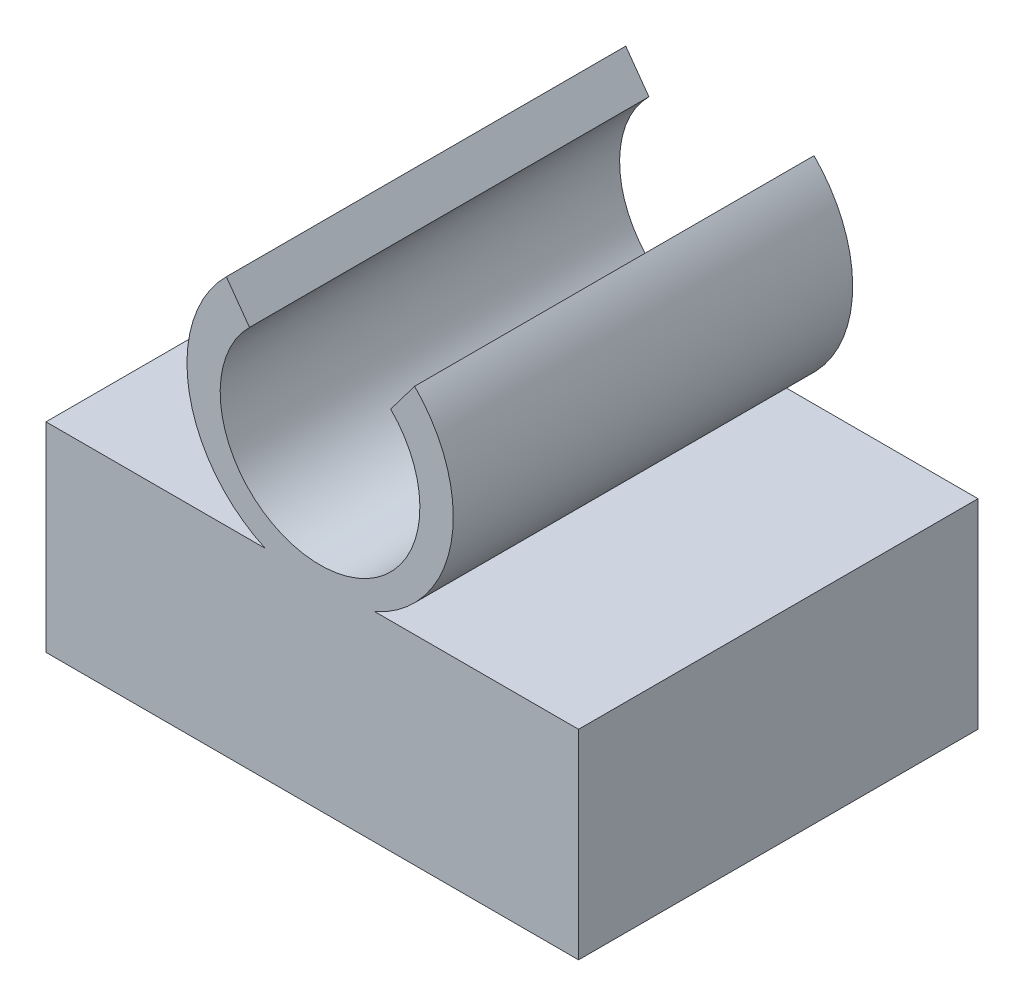
ISO-10303-21;
HEADER;
FILE_DESCRIPTION(('STEP AP214'),'2;1');
FILE_NAME('part.step','',(''),(''),'','','');
FILE_SCHEMA(('AUTOMOTIVE_DESIGN { 1 0 10303 214 1 1 1 1 }'));
ENDSEC;
DATA;
#1=APPLICATION_CONTEXT('core data for automotive mechanical design processes');
#2=APPLICATION_PROTOCOL_DEFINITION('international standard','automotive_design',2000,#1);
#3=PRODUCT_CONTEXT('',#1,'mechanical');
#4=PRODUCT('Part','Part','',(#3));
#5=PRODUCT_RELATED_PRODUCT_CATEGORY('part','',(#4));
#6=PRODUCT_DEFINITION_FORMATION('','',#4);
#7=PRODUCT_DEFINITION_CONTEXT('part definition',#1,'design');
#8=PRODUCT_DEFINITION('design','',#6,#7);
#9=PRODUCT_DEFINITION_SHAPE('','',#8);
#10=(LENGTH_UNIT() NAMED_UNIT(*) SI_UNIT(.MILLI.,.METRE.));
#11=(NAMED_UNIT(*) PLANE_ANGLE_UNIT() SI_UNIT($,.RADIAN.));
#12=(NAMED_UNIT(*) SI_UNIT($,.STERADIAN.) SOLID_ANGLE_UNIT());
#13=UNCERTAINTY_MEASURE_WITH_UNIT(LENGTH_MEASURE(1.E-05),#10,'distance_accuracy_value','');
#14=(GEOMETRIC_REPRESENTATION_CONTEXT(3) GLOBAL_UNCERTAINTY_ASSIGNED_CONTEXT((#13)) GLOBAL_UNIT_ASSIGNED_CONTEXT((#10,
#11,#12)) REPRESENTATION_CONTEXT('',''));
#15=CARTESIAN_POINT('',(0.,0.,0.));
#16=DIRECTION('',(0.,0.,1.));
#17=DIRECTION('',(1.,0.,0.));
#18=AXIS2_PLACEMENT_3D('',#15,#16,#17);
#19=CARTESIAN_POINT('',(7.63620667777105,48.2249166046027,12.9424778761063));
#20=DIRECTION('',(0.,0.,-1.));
#21=DIRECTION('',(-1.,0.,0.));
#22=AXIS2_PLACEMENT_3D('',#19,#20,#21);
#23=CYLINDRICAL_SURFACE('',#22,20.);
#24=DIRECTION('',(0.,0.,-1.));
#25=VECTOR('',#24,1.);
#26=CARTESIAN_POINT('',(15.8734643983524,30.,12.9424778761063));
#27=LINE('',#26,#25);
#28=CARTESIAN_POINT('',(15.8734643983524,30.,-47.0575221238938));
#29=VERTEX_POINT('',#28);
#30=CARTESIAN_POINT('',(15.8734643983524,30.,12.9424778761063));
#31=VERTEX_POINT('',#30);
#32=EDGE_CURVE('E213',#29,#31,#27,.F.);
#33=ORIENTED_EDGE('',*,*,#32,.F.);
#34=CARTESIAN_POINT('',(7.63620667777105,48.2249166046027,-47.0575221238938));
#35=DIRECTION('',(0.,0.,-1.));
#36=DIRECTION('',(1.,0.,0.));
#37=AXIS2_PLACEMENT_3D('',#34,#35,#36);
#38=CIRCLE('',#37,20.);
#39=CARTESIAN_POINT('',(21.8325716530734,62.3126141271934,-47.0575221238938));
#40=VERTEX_POINT('',#39);
#41=EDGE_CURVE('E227',#40,#29,#38,.T.);
#42=ORIENTED_EDGE('',*,*,#41,.F.);
#43=DIRECTION('',(0.,0.,-1.));
#44=VECTOR('',#43,1.);
#45=CARTESIAN_POINT('',(21.8325716530734,62.3126141271934,12.9424778761063));
#46=LINE('',#45,#44);
#47=CARTESIAN_POINT('',(21.8325716530734,62.3126141271934,12.9424778761063));
#48=VERTEX_POINT('',#47);
#49=EDGE_CURVE('E11',#48,#40,#46,.T.);
#50=ORIENTED_EDGE('',*,*,#49,.F.);
#51=CARTESIAN_POINT('',(7.63620667777105,48.2249166046027,12.9424778761063));
#52=DIRECTION('',(0.,0.,-1.));
#53=DIRECTION('',(1.,0.,0.));
#54=AXIS2_PLACEMENT_3D('',#51,#52,#53);
#55=CIRCLE('',#54,20.);
#56=EDGE_CURVE('E59',#48,#31,#55,.T.);
#57=ORIENTED_EDGE('',*,*,#56,.T.);
#58=EDGE_LOOP('',(#33,#42,#50,#57));
#59=FACE_BOUND('',#58,.T.);
#60=ADVANCED_FACE('F34',(#59),#23,.T.);
#61=DIRECTION('',(0.,0.,-1.));
#62=VECTOR('',#61,1.);
#63=CARTESIAN_POINT('',(-0.601051042810327,30.,12.9424778761063));
#64=LINE('',#63,#62);
#65=CARTESIAN_POINT('',(-0.601051042810327,30.,12.9424778761063));
#66=VERTEX_POINT('',#65);
#67=CARTESIAN_POINT('',(-0.60105104281033,30.,-47.0575221238938));
#68=VERTEX_POINT('',#67);
#69=EDGE_CURVE('E51',#66,#68,#64,.T.);
#70=ORIENTED_EDGE('',*,*,#69,.F.);
#71=CARTESIAN_POINT('',(-6.45149084481978,62.4212815799049,12.9424778761063));
#72=VERTEX_POINT('',#71);
#73=EDGE_CURVE('E218',#66,#72,#55,.T.);
#74=ORIENTED_EDGE('',*,*,#73,.T.);
#75=DIRECTION('',(0.,0.,-1.));
#76=VECTOR('',#75,1.);
#77=CARTESIAN_POINT('',(-6.45149084481978,62.4212815799049,12.9424778761063));
#78=LINE('',#77,#76);
#79=CARTESIAN_POINT('',(-6.45149084481978,62.4212815799049,-47.0575221238938));
#80=VERTEX_POINT('',#79);
#81=EDGE_CURVE('E38',#72,#80,#78,.T.);
#82=ORIENTED_EDGE('',*,*,#81,.T.);
#83=EDGE_CURVE('E215',#68,#80,#38,.T.);
#84=ORIENTED_EDGE('',*,*,#83,.F.);
#85=EDGE_LOOP('',(#70,#74,#82,#84));
#86=FACE_BOUND('',#85,.T.);
#87=ADVANCED_FACE('F36',(#86),#23,.T.);
#88=CARTESIAN_POINT('',(18.2416559294029,57.5460200630048,12.9424778761063));
#89=DIRECTION('',(-0.798713667423505,0.601711290795589,0.));
#90=DIRECTION('',(-0.601711290795589,-0.798713667423505,0.));
#91=AXIS2_PLACEMENT_3D('',#88,#89,#90);
#92=PLANE('',#91);
#93=DIRECTION('',(0.601711290795589,0.798713667423505,0.));
#94=VECTOR('',#93,1.);
#95=CARTESIAN_POINT('',(18.2416559294029,57.5460200630048,-47.0575221238938));
#96=LINE('',#95,#94);
#97=CARTESIAN_POINT('',(18.2416559294029,57.5460200630048,-47.0575221238938));
#98=VERTEX_POINT('',#97);
#99=EDGE_CURVE('E236',#98,#40,#96,.T.);
#100=ORIENTED_EDGE('',*,*,#99,.F.);
#101=DIRECTION('',(0.,0.,-1.));
#102=VECTOR('',#101,1.);
#103=CARTESIAN_POINT('',(18.2416559294029,57.5460200630048,12.9424778761063));
#104=LINE('',#103,#102);
#105=CARTESIAN_POINT('',(18.2416559294029,57.5460200630048,12.9424778761063));
#106=VERTEX_POINT('',#105);
#107=EDGE_CURVE('E43',#106,#98,#104,.T.);
#108=ORIENTED_EDGE('',*,*,#107,.F.);
#109=DIRECTION('',(0.601711290795589,0.798713667423505,0.));
#110=VECTOR('',#109,1.);
#111=CARTESIAN_POINT('',(18.2416559294029,57.5460200630048,12.9424778761063));
#112=LINE('',#111,#110);
#113=EDGE_CURVE('E224',#106,#48,#112,.T.);
#114=ORIENTED_EDGE('',*,*,#113,.T.);
#115=ORIENTED_EDGE('',*,*,#49,.T.);
#116=EDGE_LOOP('',(#100,#108,#114,#115));
#117=FACE_BOUND('',#116,.T.);
#118=ADVANCED_FACE('F264',(#117),#92,.T.);
#119=CARTESIAN_POINT('',(7.62322442857798,46.9512613369984,12.9424778761063));
#120=DIRECTION('',(0.,0.,-1.));
#121=DIRECTION('',(-1.,0.,0.));
#122=AXIS2_PLACEMENT_3D('',#119,#120,#121);
#123=CYLINDRICAL_SURFACE('',#122,15.);
#124=CARTESIAN_POINT('',(7.62322442857798,46.9512613369984,-47.0575221238938));
#125=DIRECTION('',(0.,0.,1.));
#126=DIRECTION('',(1.,0.,0.));
#127=AXIS2_PLACEMENT_3D('',#124,#125,#126);
#128=CIRCLE('',#127,15.);
#129=CARTESIAN_POINT('',(-2.97153429742851,57.5696928378232,-47.0575221238938));
#130=VERTEX_POINT('',#129);
#131=EDGE_CURVE('E233',#130,#98,#128,.T.);
#132=ORIENTED_EDGE('',*,*,#131,.F.);
#133=DIRECTION('',(0.,0.,-1.));
#134=VECTOR('',#133,1.);
#135=CARTESIAN_POINT('',(-2.97153429742851,57.5696928378232,12.9424778761063));
#136=LINE('',#135,#134);
#137=CARTESIAN_POINT('',(-2.97153429742851,57.5696928378232,12.9424778761063));
#138=VERTEX_POINT('',#137);
#139=EDGE_CURVE('E239',#138,#130,#136,.T.);
#140=ORIENTED_EDGE('',*,*,#139,.F.);
#141=CARTESIAN_POINT('',(7.62322442857798,46.9512613369984,12.9424778761063));
#142=DIRECTION('',(0.,0.,1.));
#143=DIRECTION('',(1.,0.,0.));
#144=AXIS2_PLACEMENT_3D('',#141,#142,#143);
#145=CIRCLE('',#144,15.);
#146=EDGE_CURVE('E221',#138,#106,#145,.T.);
#147=ORIENTED_EDGE('',*,*,#146,.T.);
#148=ORIENTED_EDGE('',*,*,#107,.T.);
#149=EDGE_LOOP('',(#132,#140,#147,#148));
#150=FACE_BOUND('',#149,.T.);
#151=ADVANCED_FACE('F262',(#150),#123,.F.);
#152=CARTESIAN_POINT('',(-2.97153429742851,57.5696928378232,12.9424778761063));
#153=DIRECTION('',(0.812580373892199,0.582849153696918,0.));
#154=DIRECTION('',(-0.582849153696918,0.812580373892199,0.));
#155=AXIS2_PLACEMENT_3D('',#152,#153,#154);
#156=PLANE('',#155);
#157=DIRECTION('',(0.582849153696918,-0.812580373892199,0.));
#158=VECTOR('',#157,1.);
#159=CARTESIAN_POINT('',(-2.97153429742851,57.5696928378232,-47.0575221238938));
#160=LINE('',#159,#158);
#161=EDGE_CURVE('E230',#80,#130,#160,.T.);
#162=ORIENTED_EDGE('',*,*,#161,.F.);
#163=ORIENTED_EDGE('',*,*,#81,.F.);
#164=DIRECTION('',(0.582849153696918,-0.812580373892199,0.));
#165=VECTOR('',#164,1.);
#166=CARTESIAN_POINT('',(-2.97153429742851,57.5696928378232,12.9424778761063));
#167=LINE('',#166,#165);
#168=EDGE_CURVE('E217',#72,#138,#167,.T.);
#169=ORIENTED_EDGE('',*,*,#168,.T.);
#170=ORIENTED_EDGE('',*,*,#139,.T.);
#171=EDGE_LOOP('',(#162,#163,#169,#170));
#172=FACE_BOUND('',#171,.T.);
#173=ADVANCED_FACE('F246',(#172),#156,.T.);
#174=CARTESIAN_POINT('',(7.63620667777105,48.2249166046027,12.9424778761063));
#175=DIRECTION('',(0.,0.,1.));
#176=DIRECTION('',(1.,0.,0.));
#177=AXIS2_PLACEMENT_3D('',#174,#175,#176);
#178=PLANE('',#177);
#179=ORIENTED_EDGE('',*,*,#73,.F.);
#180=DIRECTION('',(1.,0.,0.));
#181=VECTOR('',#180,1.);
#182=CARTESIAN_POINT('',(-33.5398230088496,30.,12.9424778761062));
#183=LINE('',#182,#181);
#184=CARTESIAN_POINT('',(-33.5398230088496,30.,12.9424778761062));
#185=VERTEX_POINT('',#184);
#186=EDGE_CURVE('E184',#185,#66,#183,.T.);
#187=ORIENTED_EDGE('',*,*,#186,.F.);
#188=DIRECTION('',(0.,-1.,0.));
#189=VECTOR('',#188,1.);
#190=CARTESIAN_POINT('',(-33.5398230088496,30.,12.9424778761062));
#191=LINE('',#190,#189);
#192=CARTESIAN_POINT('',(-33.5398230088496,0.,12.9424778761062));
#193=VERTEX_POINT('',#192);
#194=EDGE_CURVE('E209',#185,#193,#191,.T.);
#195=ORIENTED_EDGE('',*,*,#194,.T.);
#196=DIRECTION('',(1.,0.,0.));
#197=VECTOR('',#196,1.);
#198=CARTESIAN_POINT('',(-33.5398230088496,0.,12.9424778761062));
#199=LINE('',#198,#197);
#200=CARTESIAN_POINT('',(46.4601769911504,0.,12.9424778761062));
#201=VERTEX_POINT('',#200);
#202=EDGE_CURVE('E196',#193,#201,#199,.T.);
#203=ORIENTED_EDGE('',*,*,#202,.T.);
#204=DIRECTION('',(0.,-1.,0.));
#205=VECTOR('',#204,1.);
#206=CARTESIAN_POINT('',(46.4601769911504,30.,12.9424778761062));
#207=LINE('',#206,#205);
#208=CARTESIAN_POINT('',(46.4601769911504,30.,12.9424778761062));
#209=VERTEX_POINT('',#208);
#210=EDGE_CURVE('E206',#209,#201,#207,.T.);
#211=ORIENTED_EDGE('',*,*,#210,.F.);
#212=EDGE_CURVE('E182',#31,#209,#183,.T.);
#213=ORIENTED_EDGE('',*,*,#212,.F.);
#214=ORIENTED_EDGE('',*,*,#56,.F.);
#215=ORIENTED_EDGE('',*,*,#113,.F.);
#216=ORIENTED_EDGE('',*,*,#146,.F.);
#217=ORIENTED_EDGE('',*,*,#168,.F.);
#218=EDGE_LOOP('',(#179,#187,#195,#203,#211,#213,#214,#215,#216,#217));
#219=FACE_BOUND('',#218,.T.);
#220=ADVANCED_FACE('F258',(#219),#178,.T.);
#221=CARTESIAN_POINT('',(7.63620667777105,48.2249166046027,-47.0575221238938));
#222=DIRECTION('',(0.,0.,1.));
#223=DIRECTION('',(1.,0.,0.));
#224=AXIS2_PLACEMENT_3D('',#221,#222,#223);
#225=PLANE('',#224);
#226=ORIENTED_EDGE('',*,*,#41,.T.);
#227=DIRECTION('',(-1.,0.,0.));
#228=VECTOR('',#227,1.);
#229=CARTESIAN_POINT('',(-33.5398230088496,30.,-47.0575221238938));
#230=LINE('',#229,#228);
#231=CARTESIAN_POINT('',(46.4601769911504,30.,-47.0575221238938));
#232=VERTEX_POINT('',#231);
#233=EDGE_CURVE('E190',#232,#29,#230,.T.);
#234=ORIENTED_EDGE('',*,*,#233,.F.);
#235=DIRECTION('',(0.,-1.,0.));
#236=VECTOR('',#235,1.);
#237=CARTESIAN_POINT('',(46.4601769911504,30.,-47.0575221238938));
#238=LINE('',#237,#236);
#239=CARTESIAN_POINT('',(46.4601769911504,0.,-47.0575221238938));
#240=VERTEX_POINT('',#239);
#241=EDGE_CURVE('E203',#232,#240,#238,.T.);
#242=ORIENTED_EDGE('',*,*,#241,.T.);
#243=DIRECTION('',(-1.,0.,0.));
#244=VECTOR('',#243,1.);
#245=CARTESIAN_POINT('',(-33.5398230088496,0.,-47.0575221238938));
#246=LINE('',#245,#244);
#247=CARTESIAN_POINT('',(-33.5398230088496,0.,-47.0575221238938));
#248=VERTEX_POINT('',#247);
#249=EDGE_CURVE('E183',#240,#248,#246,.T.);
#250=ORIENTED_EDGE('',*,*,#249,.T.);
#251=DIRECTION('',(0.,-1.,0.));
#252=VECTOR('',#251,1.);
#253=CARTESIAN_POINT('',(-33.5398230088496,30.,-47.0575221238938));
#254=LINE('',#253,#252);
#255=CARTESIAN_POINT('',(-33.5398230088496,30.,-47.0575221238938));
#256=VERTEX_POINT('',#255);
#257=EDGE_CURVE('E193',#256,#248,#254,.T.);
#258=ORIENTED_EDGE('',*,*,#257,.F.);
#259=EDGE_CURVE('E189',#68,#256,#230,.T.);
#260=ORIENTED_EDGE('',*,*,#259,.F.);
#261=ORIENTED_EDGE('',*,*,#83,.T.);
#262=ORIENTED_EDGE('',*,*,#161,.T.);
#263=ORIENTED_EDGE('',*,*,#131,.T.);
#264=ORIENTED_EDGE('',*,*,#99,.T.);
#265=EDGE_LOOP('',(#226,#234,#242,#250,#258,#260,#261,#262,#263,#264));
#266=FACE_BOUND('',#265,.T.);
#267=DIRECTION('',(1.,0.,0.));
#268=VECTOR('',#267,1.);
#269=CARTESIAN_POINT('',(-29.7926890714723,27.2273657543082,-47.0575221238938));
#270=LINE('',#269,#268);
#271=CARTESIAN_POINT('',(-29.7926890714723,27.2273657543082,-47.0575221238938));
#272=VERTEX_POINT('',#271);
#273=CARTESIAN_POINT('',(42.2073109285277,27.2273657543082,-47.0575221238938));
#274=VERTEX_POINT('',#273);
#275=EDGE_CURVE('E169',#272,#274,#270,.T.);
#276=ORIENTED_EDGE('',*,*,#275,.F.);
#277=DIRECTION('',(0.,1.,0.));
#278=VECTOR('',#277,1.);
#279=CARTESIAN_POINT('',(-29.7926890714723,2.22736575430824,-47.0575221238938));
#280=LINE('',#279,#278);
#281=CARTESIAN_POINT('',(-29.7926890714723,2.22736575430824,-47.0575221238938));
#282=VERTEX_POINT('',#281);
#283=EDGE_CURVE('E143',#282,#272,#280,.T.);
#284=ORIENTED_EDGE('',*,*,#283,.F.);
#285=DIRECTION('',(-1.,0.,0.));
#286=VECTOR('',#285,1.);
#287=CARTESIAN_POINT('',(-29.7926890714723,2.22736575430824,-47.0575221238938));
#288=LINE('',#287,#286);
#289=CARTESIAN_POINT('',(42.2073109285277,2.22736575430824,-47.0575221238938));
#290=VERTEX_POINT('',#289);
#291=EDGE_CURVE('E160',#290,#282,#288,.T.);
#292=ORIENTED_EDGE('',*,*,#291,.F.);
#293=DIRECTION('',(0.,-1.,0.));
#294=VECTOR('',#293,1.);
#295=CARTESIAN_POINT('',(42.2073109285277,2.22736575430824,-47.0575221238938));
#296=LINE('',#295,#294);
#297=EDGE_CURVE('E163',#274,#290,#296,.T.);
#298=ORIENTED_EDGE('',*,*,#297,.F.);
#299=EDGE_LOOP('',(#276,#284,#292,#298));
#300=FACE_BOUND('',#299,.T.);
#301=ADVANCED_FACE('F248',(#266,#300),#225,.F.);
#302=CARTESIAN_POINT('',(0.,30.,0.));
#303=DIRECTION('',(0.,1.,0.));
#304=DIRECTION('',(0.,0.,1.));
#305=AXIS2_PLACEMENT_3D('',#302,#303,#304);
#306=PLANE('',#305);
#307=ORIENTED_EDGE('',*,*,#233,.T.);
#308=ORIENTED_EDGE('',*,*,#32,.T.);
#309=ORIENTED_EDGE('',*,*,#212,.T.);
#310=DIRECTION('',(0.,0.,-1.));
#311=VECTOR('',#310,1.);
#312=CARTESIAN_POINT('',(46.4601769911504,30.,-47.0575221238938));
#313=LINE('',#312,#311);
#314=EDGE_CURVE('E187',#209,#232,#313,.T.);
#315=ORIENTED_EDGE('',*,*,#314,.T.);
#316=EDGE_LOOP('',(#307,#308,#309,#315));
#317=FACE_BOUND('',#316,.T.);
#318=ADVANCED_FACE('F268',(#317),#306,.T.);
#319=CARTESIAN_POINT('',(-33.5398230088496,30.,-47.0575221238938));
#320=DIRECTION('',(1.,0.,0.));
#321=DIRECTION('',(0.,0.,-1.));
#322=AXIS2_PLACEMENT_3D('',#319,#320,#321);
#323=PLANE('',#322);
#324=DIRECTION('',(0.,0.,1.));
#325=VECTOR('',#324,1.);
#326=CARTESIAN_POINT('',(-33.5398230088496,0.,-47.0575221238938));
#327=LINE('',#326,#325);
#328=EDGE_CURVE('E175',#248,#193,#327,.T.);
#329=ORIENTED_EDGE('',*,*,#328,.T.);
#330=ORIENTED_EDGE('',*,*,#194,.F.);
#331=DIRECTION('',(0.,0.,1.));
#332=VECTOR('',#331,1.);
#333=CARTESIAN_POINT('',(-33.5398230088496,30.,-47.0575221238938));
#334=LINE('',#333,#332);
#335=EDGE_CURVE('E179',#256,#185,#334,.T.);
#336=ORIENTED_EDGE('',*,*,#335,.F.);
#337=ORIENTED_EDGE('',*,*,#257,.T.);
#338=EDGE_LOOP('',(#329,#330,#336,#337));
#339=FACE_BOUND('',#338,.T.);
#340=ADVANCED_FACE('F281',(#339),#323,.F.);
#341=CARTESIAN_POINT('',(46.4601769911504,30.,-47.0575221238938));
#342=DIRECTION('',(-1.,0.,0.));
#343=DIRECTION('',(0.,0.,1.));
#344=AXIS2_PLACEMENT_3D('',#341,#342,#343);
#345=PLANE('',#344);
#346=DIRECTION('',(0.,0.,-1.));
#347=VECTOR('',#346,1.);
#348=CARTESIAN_POINT('',(46.4601769911504,0.,-47.0575221238938));
#349=LINE('',#348,#347);
#350=EDGE_CURVE('E198',#201,#240,#349,.T.);
#351=ORIENTED_EDGE('',*,*,#350,.T.);
#352=ORIENTED_EDGE('',*,*,#241,.F.);
#353=ORIENTED_EDGE('',*,*,#314,.F.);
#354=ORIENTED_EDGE('',*,*,#210,.T.);
#355=EDGE_LOOP('',(#351,#352,#353,#354));
#356=FACE_BOUND('',#355,.T.);
#357=ADVANCED_FACE('F274',(#356),#345,.F.);
#358=ORIENTED_EDGE('',*,*,#186,.T.);
#359=ORIENTED_EDGE('',*,*,#69,.T.);
#360=ORIENTED_EDGE('',*,*,#259,.T.);
#361=ORIENTED_EDGE('',*,*,#335,.T.);
#362=EDGE_LOOP('',(#358,#359,#360,#361));
#363=FACE_BOUND('',#362,.T.);
#364=ADVANCED_FACE('F255',(#363),#306,.T.);
#365=CARTESIAN_POINT('',(0.,0.,0.));
#366=DIRECTION('',(0.,1.,0.));
#367=DIRECTION('',(0.,0.,1.));
#368=AXIS2_PLACEMENT_3D('',#365,#366,#367);
#369=PLANE('',#368);
#370=ORIENTED_EDGE('',*,*,#328,.F.);
#371=ORIENTED_EDGE('',*,*,#249,.F.);
#372=ORIENTED_EDGE('',*,*,#350,.F.);
#373=ORIENTED_EDGE('',*,*,#202,.F.);
#374=EDGE_LOOP('',(#370,#371,#372,#373));
#375=FACE_BOUND('',#374,.T.);
#376=ADVANCED_FACE('F279',(#375),#369,.F.);
#377=CARTESIAN_POINT('',(-29.7926890714723,2.22736575430824,7.94247787610622));
#378=DIRECTION('',(-1.,0.,0.));
#379=DIRECTION('',(0.,0.,1.));
#380=AXIS2_PLACEMENT_3D('',#377,#378,#379);
#381=PLANE('',#380);
#382=ORIENTED_EDGE('',*,*,#283,.T.);
#383=DIRECTION('',(0.,0.,-1.));
#384=VECTOR('',#383,1.);
#385=CARTESIAN_POINT('',(-29.7926890714723,27.2273657543082,7.94247787610622));
#386=LINE('',#385,#384);
#387=CARTESIAN_POINT('',(-29.7926890714723,27.2273657543082,7.94247787610622));
#388=VERTEX_POINT('',#387);
#389=EDGE_CURVE('E136',#388,#272,#386,.T.);
#390=ORIENTED_EDGE('',*,*,#389,.F.);
#391=DIRECTION('',(0.,1.,0.));
#392=VECTOR('',#391,1.);
#393=CARTESIAN_POINT('',(-29.7926890714723,2.22736575430824,7.94247787610622));
#394=LINE('',#393,#392);
#395=CARTESIAN_POINT('',(-29.7926890714723,2.22736575430824,7.94247787610622));
#396=VERTEX_POINT('',#395);
#397=EDGE_CURVE('E140',#396,#388,#394,.T.);
#398=ORIENTED_EDGE('',*,*,#397,.F.);
#399=DIRECTION('',(0.,0.,-1.));
#400=VECTOR('',#399,1.);
#401=CARTESIAN_POINT('',(-29.7926890714723,2.22736575430824,7.94247787610622));
#402=LINE('',#401,#400);
#403=EDGE_CURVE('E173',#396,#282,#402,.T.);
#404=ORIENTED_EDGE('',*,*,#403,.T.);
#405=EDGE_LOOP('',(#382,#390,#398,#404));
#406=FACE_BOUND('',#405,.T.);
#407=ADVANCED_FACE('F138',(#406),#381,.F.);
#408=CARTESIAN_POINT('',(-29.7926890714723,2.22736575430824,7.94247787610622));
#409=DIRECTION('',(0.,-1.,0.));
#410=DIRECTION('',(1.,0.,0.));
#411=AXIS2_PLACEMENT_3D('',#408,#409,#410);
#412=PLANE('',#411);
#413=ORIENTED_EDGE('',*,*,#291,.T.);
#414=ORIENTED_EDGE('',*,*,#403,.F.);
#415=DIRECTION('',(-1.,0.,0.));
#416=VECTOR('',#415,1.);
#417=CARTESIAN_POINT('',(-29.7926890714723,2.22736575430824,7.94247787610622));
#418=LINE('',#417,#416);
#419=CARTESIAN_POINT('',(42.2073109285277,2.22736575430824,7.94247787610622));
#420=VERTEX_POINT('',#419);
#421=EDGE_CURVE('E148',#420,#396,#418,.T.);
#422=ORIENTED_EDGE('',*,*,#421,.F.);
#423=DIRECTION('',(0.,0.,-1.));
#424=VECTOR('',#423,1.);
#425=CARTESIAN_POINT('',(42.2073109285277,2.22736575430824,7.94247787610622));
#426=LINE('',#425,#424);
#427=EDGE_CURVE('E176',#420,#290,#426,.T.);
#428=ORIENTED_EDGE('',*,*,#427,.T.);
#429=EDGE_LOOP('',(#413,#414,#422,#428));
#430=FACE_BOUND('',#429,.T.);
#431=ADVANCED_FACE('F344',(#430),#412,.F.);
#432=CARTESIAN_POINT('',(42.2073109285277,2.22736575430824,7.94247787610622));
#433=DIRECTION('',(1.,0.,0.));
#434=DIRECTION('',(0.,0.,-1.));
#435=AXIS2_PLACEMENT_3D('',#432,#433,#434);
#436=PLANE('',#435);
#437=ORIENTED_EDGE('',*,*,#297,.T.);
#438=ORIENTED_EDGE('',*,*,#427,.F.);
#439=DIRECTION('',(0.,-1.,0.));
#440=VECTOR('',#439,1.);
#441=CARTESIAN_POINT('',(42.2073109285277,2.22736575430824,7.94247787610622));
#442=LINE('',#441,#440);
#443=CARTESIAN_POINT('',(42.2073109285277,27.2273657543082,7.94247787610622));
#444=VERTEX_POINT('',#443);
#445=EDGE_CURVE('E156',#444,#420,#442,.T.);
#446=ORIENTED_EDGE('',*,*,#445,.F.);
#447=DIRECTION('',(0.,0.,-1.));
#448=VECTOR('',#447,1.);
#449=CARTESIAN_POINT('',(42.2073109285277,27.2273657543082,7.94247787610622));
#450=LINE('',#449,#448);
#451=EDGE_CURVE('E147',#444,#274,#450,.T.);
#452=ORIENTED_EDGE('',*,*,#451,.T.);
#453=EDGE_LOOP('',(#437,#438,#446,#452));
#454=FACE_BOUND('',#453,.T.);
#455=ADVANCED_FACE('F352',(#454),#436,.F.);
#456=CARTESIAN_POINT('',(-29.7926890714723,27.2273657543082,7.94247787610622));
#457=DIRECTION('',(0.,1.,0.));
#458=DIRECTION('',(-1.,0.,0.));
#459=AXIS2_PLACEMENT_3D('',#456,#457,#458);
#460=PLANE('',#459);
#461=ORIENTED_EDGE('',*,*,#275,.T.);
#462=ORIENTED_EDGE('',*,*,#451,.F.);
#463=DIRECTION('',(1.,0.,0.));
#464=VECTOR('',#463,1.);
#465=CARTESIAN_POINT('',(-29.7926890714723,27.2273657543082,7.94247787610622));
#466=LINE('',#465,#464);
#467=EDGE_CURVE('E151',#388,#444,#466,.T.);
#468=ORIENTED_EDGE('',*,*,#467,.F.);
#469=ORIENTED_EDGE('',*,*,#389,.T.);
#470=EDGE_LOOP('',(#461,#462,#468,#469));
#471=FACE_BOUND('',#470,.T.);
#472=ADVANCED_FACE('F152',(#471),#460,.F.);
#473=CARTESIAN_POINT('',(0.,0.,7.94247787610622));
#474=DIRECTION('',(0.,0.,-1.));
#475=DIRECTION('',(-1.,0.,0.));
#476=AXIS2_PLACEMENT_3D('',#473,#474,#475);
#477=PLANE('',#476);
#478=ORIENTED_EDGE('',*,*,#397,.T.);
#479=ORIENTED_EDGE('',*,*,#467,.T.);
#480=ORIENTED_EDGE('',*,*,#445,.T.);
#481=ORIENTED_EDGE('',*,*,#421,.T.);
#482=EDGE_LOOP('',(#478,#479,#480,#481));
#483=FACE_BOUND('',#482,.T.);
#484=ADVANCED_FACE('F158',(#483),#477,.T.);
#485=CLOSED_SHELL('',(#60,#87,#118,#151,#173,#220,#301,#318,#340,#357,#364,#376,#407,#431,#455,
#472,#484));
#486=MANIFOLD_SOLID_BREP('B2',#485);
#487=ADVANCED_BREP_SHAPE_REPRESENTATION('',(#18,#486),#14);
#488=SHAPE_DEFINITION_REPRESENTATION(#9,#487);
ENDSEC;
END-ISO-10303-21;
